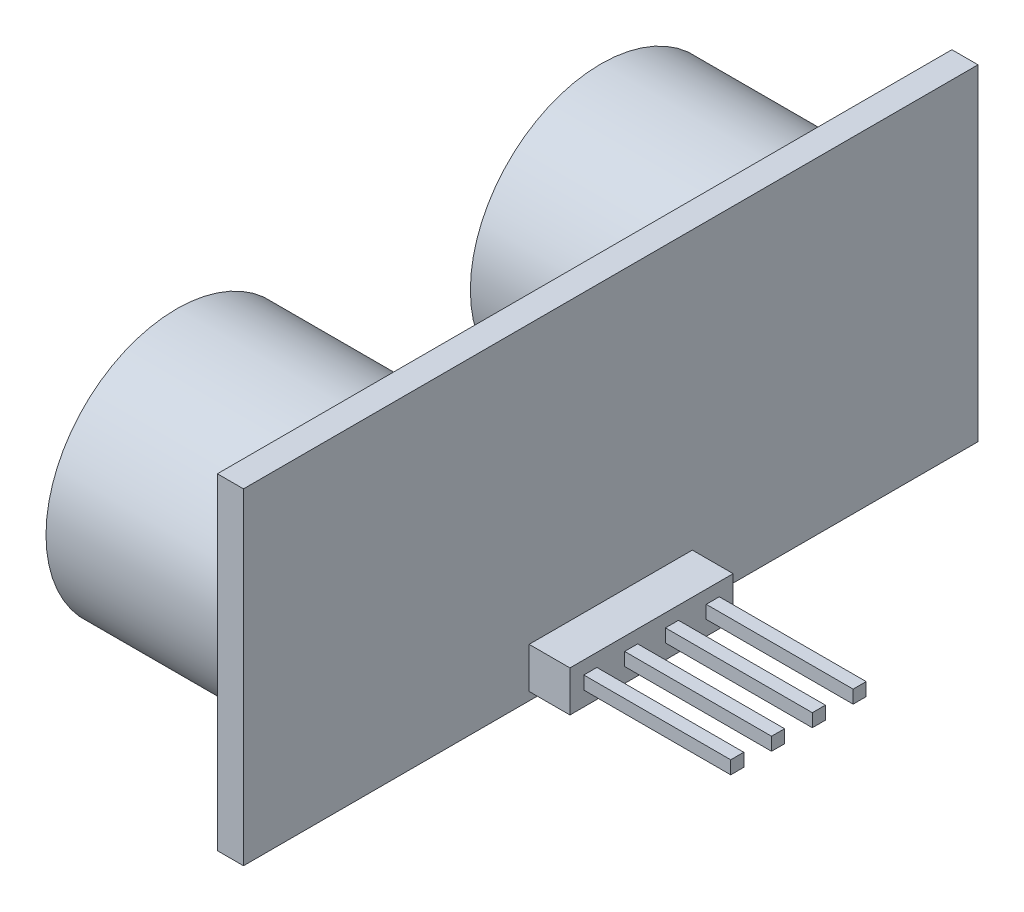
ISO-10303-21;
HEADER;
FILE_DESCRIPTION(('STEP AP214'),'2;1');
FILE_NAME('part.step','',(''),(''),'','','');
FILE_SCHEMA(('AUTOMOTIVE_DESIGN { 1 0 10303 214 1 1 1 1 }'));
ENDSEC;
DATA;
#1=APPLICATION_CONTEXT('core data for automotive mechanical design processes');
#2=APPLICATION_PROTOCOL_DEFINITION('international standard','automotive_design',2000,#1);
#3=PRODUCT_CONTEXT('',#1,'mechanical');
#4=PRODUCT('Part','Part','',(#3));
#5=PRODUCT_RELATED_PRODUCT_CATEGORY('part','',(#4));
#6=PRODUCT_DEFINITION_FORMATION('','',#4);
#7=PRODUCT_DEFINITION_CONTEXT('part definition',#1,'design');
#8=PRODUCT_DEFINITION('design','',#6,#7);
#9=PRODUCT_DEFINITION_SHAPE('','',#8);
#10=(LENGTH_UNIT() NAMED_UNIT(*) SI_UNIT(.MILLI.,.METRE.));
#11=(NAMED_UNIT(*) PLANE_ANGLE_UNIT() SI_UNIT($,.RADIAN.));
#12=(NAMED_UNIT(*) SI_UNIT($,.STERADIAN.) SOLID_ANGLE_UNIT());
#13=UNCERTAINTY_MEASURE_WITH_UNIT(LENGTH_MEASURE(1.E-05),#10,'distance_accuracy_value','');
#14=(GEOMETRIC_REPRESENTATION_CONTEXT(3) GLOBAL_UNCERTAINTY_ASSIGNED_CONTEXT((#13)) GLOBAL_UNIT_ASSIGNED_CONTEXT((#10,
#11,#12)) REPRESENTATION_CONTEXT('',''));
#15=CARTESIAN_POINT('',(0.,0.,0.));
#16=DIRECTION('',(0.,0.,1.));
#17=DIRECTION('',(1.,0.,0.));
#18=AXIS2_PLACEMENT_3D('',#15,#16,#17);
#19=CARTESIAN_POINT('',(0.8,-9.99999999999999,45.));
#20=DIRECTION('',(-1.,0.,0.));
#21=DIRECTION('',(0.,0.,1.));
#22=AXIS2_PLACEMENT_3D('',#19,#20,#21);
#23=PLANE('',#22);
#24=DIRECTION('',(0.,1.,0.));
#25=VECTOR('',#24,1.);
#26=CARTESIAN_POINT('',(0.8,-9.99999999999999,0.));
#27=LINE('',#26,#25);
#28=CARTESIAN_POINT('',(0.8,-9.99999999999999,0.));
#29=VERTEX_POINT('',#28);
#30=CARTESIAN_POINT('',(0.8,10.,0.));
#31=VERTEX_POINT('',#30);
#32=EDGE_CURVE('E363',#29,#31,#27,.T.);
#33=ORIENTED_EDGE('',*,*,#32,.T.);
#34=DIRECTION('',(0.,0.,-1.));
#35=VECTOR('',#34,1.);
#36=CARTESIAN_POINT('',(0.8,10.,45.));
#37=LINE('',#36,#35);
#38=CARTESIAN_POINT('',(0.8,10.,45.));
#39=VERTEX_POINT('',#38);
#40=EDGE_CURVE('E390',#39,#31,#37,.T.);
#41=ORIENTED_EDGE('',*,*,#40,.F.);
#42=DIRECTION('',(0.,1.,0.));
#43=VECTOR('',#42,1.);
#44=CARTESIAN_POINT('',(0.8,-9.99999999999999,45.));
#45=LINE('',#44,#43);
#46=CARTESIAN_POINT('',(0.8,-9.99999999999999,45.));
#47=VERTEX_POINT('',#46);
#48=EDGE_CURVE('E364',#47,#39,#45,.T.);
#49=ORIENTED_EDGE('',*,*,#48,.F.);
#50=DIRECTION('',(0.,0.,-1.));
#51=VECTOR('',#50,1.);
#52=CARTESIAN_POINT('',(0.8,-9.99999999999999,45.));
#53=LINE('',#52,#51);
#54=EDGE_CURVE('E374',#47,#29,#53,.T.);
#55=ORIENTED_EDGE('',*,*,#54,.T.);
#56=EDGE_LOOP('',(#33,#41,#49,#55));
#57=FACE_BOUND('',#56,.T.);
#58=DIRECTION('',(0.,1.,0.));
#59=VECTOR('',#58,1.);
#60=CARTESIAN_POINT('',(0.8,-6.99999999999999,17.5));
#61=LINE('',#60,#59);
#62=CARTESIAN_POINT('',(0.8,-9.49999999999999,17.5));
#63=VERTEX_POINT('',#62);
#64=CARTESIAN_POINT('',(0.8,-6.99999999999999,17.5));
#65=VERTEX_POINT('',#64);
#66=EDGE_CURVE('E322',#63,#65,#61,.T.);
#67=ORIENTED_EDGE('',*,*,#66,.F.);
#68=DIRECTION('',(0.,0.,-1.));
#69=VECTOR('',#68,1.);
#70=CARTESIAN_POINT('',(0.8,-9.49999999999999,27.5));
#71=LINE('',#70,#69);
#72=CARTESIAN_POINT('',(0.8,-9.49999999999999,27.5));
#73=VERTEX_POINT('',#72);
#74=EDGE_CURVE('E335',#73,#63,#71,.T.);
#75=ORIENTED_EDGE('',*,*,#74,.F.);
#76=DIRECTION('',(0.,-1.,0.));
#77=VECTOR('',#76,1.);
#78=CARTESIAN_POINT('',(0.8,-6.99999999999999,27.5));
#79=LINE('',#78,#77);
#80=CARTESIAN_POINT('',(0.8,-6.99999999999999,27.5));
#81=VERTEX_POINT('',#80);
#82=EDGE_CURVE('E347',#81,#73,#79,.T.);
#83=ORIENTED_EDGE('',*,*,#82,.F.);
#84=DIRECTION('',(0.,0.,1.));
#85=VECTOR('',#84,1.);
#86=CARTESIAN_POINT('',(0.8,-6.99999999999999,27.5));
#87=LINE('',#86,#85);
#88=EDGE_CURVE('E344',#65,#81,#87,.T.);
#89=ORIENTED_EDGE('',*,*,#88,.F.);
#90=EDGE_LOOP('',(#67,#75,#83,#89));
#91=FACE_BOUND('',#90,.T.);
#92=ADVANCED_FACE('F34',(#57,#91),#23,.F.);
#93=CARTESIAN_POINT('',(-0.8,10.,45.));
#94=DIRECTION('',(0.,-1.,0.));
#95=DIRECTION('',(0.,0.,-1.));
#96=AXIS2_PLACEMENT_3D('',#93,#94,#95);
#97=PLANE('',#96);
#98=DIRECTION('',(-1.,0.,0.));
#99=VECTOR('',#98,1.);
#100=CARTESIAN_POINT('',(-0.8,10.,0.));
#101=LINE('',#100,#99);
#102=CARTESIAN_POINT('',(-0.8,10.,0.));
#103=VERTEX_POINT('',#102);
#104=EDGE_CURVE('E377',#31,#103,#101,.T.);
#105=ORIENTED_EDGE('',*,*,#104,.T.);
#106=DIRECTION('',(0.,0.,-1.));
#107=VECTOR('',#106,1.);
#108=CARTESIAN_POINT('',(-0.8,10.,45.));
#109=LINE('',#108,#107);
#110=CARTESIAN_POINT('',(-0.8,10.,45.));
#111=VERTEX_POINT('',#110);
#112=EDGE_CURVE('E387',#111,#103,#109,.T.);
#113=ORIENTED_EDGE('',*,*,#112,.F.);
#114=DIRECTION('',(-1.,0.,0.));
#115=VECTOR('',#114,1.);
#116=CARTESIAN_POINT('',(-0.8,10.,45.));
#117=LINE('',#116,#115);
#118=EDGE_CURVE('E367',#39,#111,#117,.T.);
#119=ORIENTED_EDGE('',*,*,#118,.F.);
#120=ORIENTED_EDGE('',*,*,#40,.T.);
#121=EDGE_LOOP('',(#105,#113,#119,#120));
#122=FACE_BOUND('',#121,.T.);
#123=ADVANCED_FACE('F401',(#122),#97,.F.);
#124=CARTESIAN_POINT('',(-0.8,-9.99999999999999,45.));
#125=DIRECTION('',(1.,0.,0.));
#126=DIRECTION('',(0.,0.,-1.));
#127=AXIS2_PLACEMENT_3D('',#124,#125,#126);
#128=PLANE('',#127);
#129=CARTESIAN_POINT('',(-0.8,0.,35.5));
#130=DIRECTION('',(1.,0.,0.));
#131=DIRECTION('',(0.,0.,-1.));
#132=AXIS2_PLACEMENT_3D('',#129,#130,#131);
#133=CIRCLE('',#132,8.);
#134=CARTESIAN_POINT('',(-0.8,0.,27.5));
#135=VERTEX_POINT('',#134);
#136=EDGE_CURVE('E11',#135,#135,#133,.F.);
#137=ORIENTED_EDGE('',*,*,#136,.F.);
#138=EDGE_LOOP('',(#137));
#139=FACE_BOUND('',#138,.T.);
#140=CARTESIAN_POINT('',(-0.8,0.,9.5));
#141=DIRECTION('',(1.,0.,0.));
#142=DIRECTION('',(0.,0.,-1.));
#143=AXIS2_PLACEMENT_3D('',#140,#141,#142);
#144=CIRCLE('',#143,8.);
#145=CARTESIAN_POINT('',(-0.8,0.,1.5));
#146=VERTEX_POINT('',#145);
#147=EDGE_CURVE('E41',#146,#146,#144,.F.);
#148=ORIENTED_EDGE('',*,*,#147,.F.);
#149=EDGE_LOOP('',(#148));
#150=FACE_BOUND('',#149,.T.);
#151=DIRECTION('',(0.,-1.,0.));
#152=VECTOR('',#151,1.);
#153=CARTESIAN_POINT('',(-0.8,-9.99999999999999,0.));
#154=LINE('',#153,#152);
#155=CARTESIAN_POINT('',(-0.8,-9.99999999999999,0.));
#156=VERTEX_POINT('',#155);
#157=EDGE_CURVE('E379',#103,#156,#154,.T.);
#158=ORIENTED_EDGE('',*,*,#157,.T.);
#159=DIRECTION('',(0.,0.,-1.));
#160=VECTOR('',#159,1.);
#161=CARTESIAN_POINT('',(-0.8,-9.99999999999999,45.));
#162=LINE('',#161,#160);
#163=CARTESIAN_POINT('',(-0.8,-9.99999999999999,45.));
#164=VERTEX_POINT('',#163);
#165=EDGE_CURVE('E384',#164,#156,#162,.T.);
#166=ORIENTED_EDGE('',*,*,#165,.F.);
#167=DIRECTION('',(0.,-1.,0.));
#168=VECTOR('',#167,1.);
#169=CARTESIAN_POINT('',(-0.8,-9.99999999999999,45.));
#170=LINE('',#169,#168);
#171=EDGE_CURVE('E370',#111,#164,#170,.T.);
#172=ORIENTED_EDGE('',*,*,#171,.F.);
#173=ORIENTED_EDGE('',*,*,#112,.T.);
#174=EDGE_LOOP('',(#158,#166,#172,#173));
#175=FACE_BOUND('',#174,.T.);
#176=ADVANCED_FACE('F397',(#139,#150,#175),#128,.F.);
#177=CARTESIAN_POINT('',(-0.8,-9.99999999999999,45.));
#178=DIRECTION('',(0.,1.,0.));
#179=DIRECTION('',(0.,0.,1.));
#180=AXIS2_PLACEMENT_3D('',#177,#178,#179);
#181=PLANE('',#180);
#182=DIRECTION('',(1.,0.,0.));
#183=VECTOR('',#182,1.);
#184=CARTESIAN_POINT('',(-0.8,-9.99999999999999,0.));
#185=LINE('',#184,#183);
#186=EDGE_CURVE('E368',#156,#29,#185,.T.);
#187=ORIENTED_EDGE('',*,*,#186,.T.);
#188=ORIENTED_EDGE('',*,*,#54,.F.);
#189=DIRECTION('',(1.,0.,0.));
#190=VECTOR('',#189,1.);
#191=CARTESIAN_POINT('',(-0.8,-9.99999999999999,45.));
#192=LINE('',#191,#190);
#193=EDGE_CURVE('E372',#164,#47,#192,.T.);
#194=ORIENTED_EDGE('',*,*,#193,.F.);
#195=ORIENTED_EDGE('',*,*,#165,.T.);
#196=EDGE_LOOP('',(#187,#188,#194,#195));
#197=FACE_BOUND('',#196,.T.);
#198=ADVANCED_FACE('F400',(#197),#181,.F.);
#199=CARTESIAN_POINT('',(0.,0.,45.));
#200=DIRECTION('',(0.,0.,-1.));
#201=DIRECTION('',(-1.,0.,0.));
#202=AXIS2_PLACEMENT_3D('',#199,#200,#201);
#203=PLANE('',#202);
#204=ORIENTED_EDGE('',*,*,#48,.T.);
#205=ORIENTED_EDGE('',*,*,#118,.T.);
#206=ORIENTED_EDGE('',*,*,#171,.T.);
#207=ORIENTED_EDGE('',*,*,#193,.T.);
#208=EDGE_LOOP('',(#204,#205,#206,#207));
#209=FACE_BOUND('',#208,.T.);
#210=ADVANCED_FACE('F420',(#209),#203,.F.);
#211=CARTESIAN_POINT('',(0.,0.,0.));
#212=DIRECTION('',(0.,0.,-1.));
#213=DIRECTION('',(-1.,0.,0.));
#214=AXIS2_PLACEMENT_3D('',#211,#212,#213);
#215=PLANE('',#214);
#216=ORIENTED_EDGE('',*,*,#32,.F.);
#217=ORIENTED_EDGE('',*,*,#186,.F.);
#218=ORIENTED_EDGE('',*,*,#157,.F.);
#219=ORIENTED_EDGE('',*,*,#104,.F.);
#220=EDGE_LOOP('',(#216,#217,#218,#219));
#221=FACE_BOUND('',#220,.T.);
#222=ADVANCED_FACE('F414',(#221),#215,.T.);
#223=CARTESIAN_POINT('',(3.3,-6.99999999999999,17.5));
#224=DIRECTION('',(0.,0.,1.));
#225=DIRECTION('',(1.,0.,0.));
#226=AXIS2_PLACEMENT_3D('',#223,#224,#225);
#227=PLANE('',#226);
#228=ORIENTED_EDGE('',*,*,#66,.T.);
#229=DIRECTION('',(-1.,0.,0.));
#230=VECTOR('',#229,1.);
#231=CARTESIAN_POINT('',(3.3,-6.99999999999999,17.5));
#232=LINE('',#231,#230);
#233=CARTESIAN_POINT('',(3.3,-6.99999999999999,17.5));
#234=VERTEX_POINT('',#233);
#235=EDGE_CURVE('E360',#234,#65,#232,.T.);
#236=ORIENTED_EDGE('',*,*,#235,.F.);
#237=DIRECTION('',(0.,1.,0.));
#238=VECTOR('',#237,1.);
#239=CARTESIAN_POINT('',(3.3,-6.99999999999999,17.5));
#240=LINE('',#239,#238);
#241=CARTESIAN_POINT('',(3.3,-9.49999999999999,17.5));
#242=VERTEX_POINT('',#241);
#243=EDGE_CURVE('E331',#242,#234,#240,.T.);
#244=ORIENTED_EDGE('',*,*,#243,.F.);
#245=DIRECTION('',(-1.,0.,0.));
#246=VECTOR('',#245,1.);
#247=CARTESIAN_POINT('',(3.3,-9.49999999999999,17.5));
#248=LINE('',#247,#246);
#249=EDGE_CURVE('E341',#242,#63,#248,.T.);
#250=ORIENTED_EDGE('',*,*,#249,.T.);
#251=EDGE_LOOP('',(#228,#236,#244,#250));
#252=FACE_BOUND('',#251,.T.);
#253=ADVANCED_FACE('F431',(#252),#227,.F.);
#254=CARTESIAN_POINT('',(3.3,-6.99999999999999,27.5));
#255=DIRECTION('',(0.,-1.,0.));
#256=DIRECTION('',(0.,0.,-1.));
#257=AXIS2_PLACEMENT_3D('',#254,#255,#256);
#258=PLANE('',#257);
#259=ORIENTED_EDGE('',*,*,#88,.T.);
#260=DIRECTION('',(-1.,0.,0.));
#261=VECTOR('',#260,1.);
#262=CARTESIAN_POINT('',(3.3,-6.99999999999999,27.5));
#263=LINE('',#262,#261);
#264=CARTESIAN_POINT('',(3.3,-6.99999999999999,27.5));
#265=VERTEX_POINT('',#264);
#266=EDGE_CURVE('E357',#265,#81,#263,.T.);
#267=ORIENTED_EDGE('',*,*,#266,.F.);
#268=DIRECTION('',(0.,0.,1.));
#269=VECTOR('',#268,1.);
#270=CARTESIAN_POINT('',(3.3,-6.99999999999999,27.5));
#271=LINE('',#270,#269);
#272=EDGE_CURVE('E334',#234,#265,#271,.T.);
#273=ORIENTED_EDGE('',*,*,#272,.F.);
#274=ORIENTED_EDGE('',*,*,#235,.T.);
#275=EDGE_LOOP('',(#259,#267,#273,#274));
#276=FACE_BOUND('',#275,.T.);
#277=ADVANCED_FACE('F436',(#276),#258,.F.);
#278=CARTESIAN_POINT('',(3.3,-6.99999999999999,27.5));
#279=DIRECTION('',(0.,0.,-1.));
#280=DIRECTION('',(-1.,0.,0.));
#281=AXIS2_PLACEMENT_3D('',#278,#279,#280);
#282=PLANE('',#281);
#283=ORIENTED_EDGE('',*,*,#82,.T.);
#284=DIRECTION('',(-1.,0.,0.));
#285=VECTOR('',#284,1.);
#286=CARTESIAN_POINT('',(3.3,-9.49999999999999,27.5));
#287=LINE('',#286,#285);
#288=CARTESIAN_POINT('',(3.3,-9.49999999999999,27.5));
#289=VERTEX_POINT('',#288);
#290=EDGE_CURVE('E354',#289,#73,#287,.T.);
#291=ORIENTED_EDGE('',*,*,#290,.F.);
#292=DIRECTION('',(0.,-1.,0.));
#293=VECTOR('',#292,1.);
#294=CARTESIAN_POINT('',(3.3,-6.99999999999999,27.5));
#295=LINE('',#294,#293);
#296=EDGE_CURVE('E337',#265,#289,#295,.T.);
#297=ORIENTED_EDGE('',*,*,#296,.F.);
#298=ORIENTED_EDGE('',*,*,#266,.T.);
#299=EDGE_LOOP('',(#283,#291,#297,#298));
#300=FACE_BOUND('',#299,.T.);
#301=ADVANCED_FACE('F440',(#300),#282,.F.);
#302=CARTESIAN_POINT('',(3.3,-9.49999999999999,27.5));
#303=DIRECTION('',(0.,1.,0.));
#304=DIRECTION('',(0.,0.,1.));
#305=AXIS2_PLACEMENT_3D('',#302,#303,#304);
#306=PLANE('',#305);
#307=ORIENTED_EDGE('',*,*,#74,.T.);
#308=ORIENTED_EDGE('',*,*,#249,.F.);
#309=DIRECTION('',(0.,0.,-1.));
#310=VECTOR('',#309,1.);
#311=CARTESIAN_POINT('',(3.3,-9.49999999999999,27.5));
#312=LINE('',#311,#310);
#313=EDGE_CURVE('E339',#289,#242,#312,.T.);
#314=ORIENTED_EDGE('',*,*,#313,.F.);
#315=ORIENTED_EDGE('',*,*,#290,.T.);
#316=EDGE_LOOP('',(#307,#308,#314,#315));
#317=FACE_BOUND('',#316,.T.);
#318=ADVANCED_FACE('F444',(#317),#306,.F.);
#319=CARTESIAN_POINT('',(3.3,0.,0.));
#320=DIRECTION('',(1.,0.,0.));
#321=DIRECTION('',(0.,0.,-1.));
#322=AXIS2_PLACEMENT_3D('',#319,#320,#321);
#323=PLANE('',#322);
#324=DIRECTION('',(0.,0.,1.));
#325=VECTOR('',#324,1.);
#326=CARTESIAN_POINT('',(3.3,-8.60094628195553,19.15));
#327=LINE('',#326,#325);
#328=CARTESIAN_POINT('',(3.3,-8.60094628195553,18.35));
#329=VERTEX_POINT('',#328);
#330=CARTESIAN_POINT('',(3.3,-8.60094628195553,19.15));
#331=VERTEX_POINT('',#330);
#332=EDGE_CURVE('E226',#329,#331,#327,.T.);
#333=ORIENTED_EDGE('',*,*,#332,.T.);
#334=DIRECTION('',(0.,1.,0.));
#335=VECTOR('',#334,1.);
#336=CARTESIAN_POINT('',(3.3,-7.80094628195553,19.15));
#337=LINE('',#336,#335);
#338=CARTESIAN_POINT('',(3.3,-7.80094628195553,19.15));
#339=VERTEX_POINT('',#338);
#340=EDGE_CURVE('E199',#331,#339,#337,.T.);
#341=ORIENTED_EDGE('',*,*,#340,.T.);
#342=DIRECTION('',(0.,0.,-1.));
#343=VECTOR('',#342,1.);
#344=CARTESIAN_POINT('',(3.3,-7.80094628195553,19.15));
#345=LINE('',#344,#343);
#346=CARTESIAN_POINT('',(3.3,-7.80094628195553,18.35));
#347=VERTEX_POINT('',#346);
#348=EDGE_CURVE('E53',#339,#347,#345,.T.);
#349=ORIENTED_EDGE('',*,*,#348,.T.);
#350=DIRECTION('',(0.,-1.,0.));
#351=VECTOR('',#350,1.);
#352=CARTESIAN_POINT('',(3.3,-7.80094628195553,18.35));
#353=LINE('',#352,#351);
#354=EDGE_CURVE('E48',#347,#329,#353,.T.);
#355=ORIENTED_EDGE('',*,*,#354,.T.);
#356=EDGE_LOOP('',(#333,#341,#349,#355));
#357=FACE_BOUND('',#356,.T.);
#358=DIRECTION('',(0.,0.,1.));
#359=VECTOR('',#358,1.);
#360=CARTESIAN_POINT('',(3.3,-8.6009462819555,21.65));
#361=LINE('',#360,#359);
#362=CARTESIAN_POINT('',(3.3,-8.6009462819555,20.85));
#363=VERTEX_POINT('',#362);
#364=CARTESIAN_POINT('',(3.3,-8.6009462819555,21.65));
#365=VERTEX_POINT('',#364);
#366=EDGE_CURVE('E231',#363,#365,#361,.T.);
#367=ORIENTED_EDGE('',*,*,#366,.T.);
#368=DIRECTION('',(0.,1.,0.));
#369=VECTOR('',#368,1.);
#370=CARTESIAN_POINT('',(3.3,-7.8009462819555,21.65));
#371=LINE('',#370,#369);
#372=CARTESIAN_POINT('',(3.3,-7.8009462819555,21.65));
#373=VERTEX_POINT('',#372);
#374=EDGE_CURVE('E250',#365,#373,#371,.T.);
#375=ORIENTED_EDGE('',*,*,#374,.T.);
#376=DIRECTION('',(0.,0.,-1.));
#377=VECTOR('',#376,1.);
#378=CARTESIAN_POINT('',(3.3,-7.8009462819555,21.65));
#379=LINE('',#378,#377);
#380=CARTESIAN_POINT('',(3.3,-7.8009462819555,20.85));
#381=VERTEX_POINT('',#380);
#382=EDGE_CURVE('E252',#373,#381,#379,.T.);
#383=ORIENTED_EDGE('',*,*,#382,.T.);
#384=DIRECTION('',(0.,-1.,0.));
#385=VECTOR('',#384,1.);
#386=CARTESIAN_POINT('',(3.3,-7.8009462819555,20.85));
#387=LINE('',#386,#385);
#388=EDGE_CURVE('E239',#381,#363,#387,.T.);
#389=ORIENTED_EDGE('',*,*,#388,.T.);
#390=EDGE_LOOP('',(#367,#375,#383,#389));
#391=FACE_BOUND('',#390,.T.);
#392=DIRECTION('',(0.,0.,1.));
#393=VECTOR('',#392,1.);
#394=CARTESIAN_POINT('',(3.3,-8.60094628195548,24.15));
#395=LINE('',#394,#393);
#396=CARTESIAN_POINT('',(3.3,-8.60094628195548,23.35));
#397=VERTEX_POINT('',#396);
#398=CARTESIAN_POINT('',(3.3,-8.60094628195548,24.15));
#399=VERTEX_POINT('',#398);
#400=EDGE_CURVE('E258',#397,#399,#395,.T.);
#401=ORIENTED_EDGE('',*,*,#400,.T.);
#402=DIRECTION('',(0.,1.,0.));
#403=VECTOR('',#402,1.);
#404=CARTESIAN_POINT('',(3.3,-7.80094628195548,24.15));
#405=LINE('',#404,#403);
#406=CARTESIAN_POINT('',(3.3,-7.80094628195548,24.15));
#407=VERTEX_POINT('',#406);
#408=EDGE_CURVE('E282',#399,#407,#405,.T.);
#409=ORIENTED_EDGE('',*,*,#408,.T.);
#410=DIRECTION('',(0.,0.,-1.));
#411=VECTOR('',#410,1.);
#412=CARTESIAN_POINT('',(3.3,-7.80094628195548,24.15));
#413=LINE('',#412,#411);
#414=CARTESIAN_POINT('',(3.3,-7.80094628195548,23.35));
#415=VERTEX_POINT('',#414);
#416=EDGE_CURVE('E284',#407,#415,#413,.T.);
#417=ORIENTED_EDGE('',*,*,#416,.T.);
#418=DIRECTION('',(0.,-1.,0.));
#419=VECTOR('',#418,1.);
#420=CARTESIAN_POINT('',(3.3,-7.80094628195548,23.35));
#421=LINE('',#420,#419);
#422=EDGE_CURVE('E271',#415,#397,#421,.T.);
#423=ORIENTED_EDGE('',*,*,#422,.T.);
#424=EDGE_LOOP('',(#401,#409,#417,#423));
#425=FACE_BOUND('',#424,.T.);
#426=DIRECTION('',(0.,0.,1.));
#427=VECTOR('',#426,1.);
#428=CARTESIAN_POINT('',(3.3,-8.60094628195545,26.65));
#429=LINE('',#428,#427);
#430=CARTESIAN_POINT('',(3.3,-8.60094628195545,25.85));
#431=VERTEX_POINT('',#430);
#432=CARTESIAN_POINT('',(3.3,-8.60094628195545,26.65));
#433=VERTEX_POINT('',#432);
#434=EDGE_CURVE('E290',#431,#433,#429,.T.);
#435=ORIENTED_EDGE('',*,*,#434,.T.);
#436=DIRECTION('',(0.,1.,0.));
#437=VECTOR('',#436,1.);
#438=CARTESIAN_POINT('',(3.3,-7.80094628195545,26.65));
#439=LINE('',#438,#437);
#440=CARTESIAN_POINT('',(3.3,-7.80094628195545,26.65));
#441=VERTEX_POINT('',#440);
#442=EDGE_CURVE('E314',#433,#441,#439,.T.);
#443=ORIENTED_EDGE('',*,*,#442,.T.);
#444=DIRECTION('',(0.,0.,-1.));
#445=VECTOR('',#444,1.);
#446=CARTESIAN_POINT('',(3.3,-7.80094628195545,26.65));
#447=LINE('',#446,#445);
#448=CARTESIAN_POINT('',(3.3,-7.80094628195545,25.85));
#449=VERTEX_POINT('',#448);
#450=EDGE_CURVE('E316',#441,#449,#447,.T.);
#451=ORIENTED_EDGE('',*,*,#450,.T.);
#452=DIRECTION('',(0.,-1.,0.));
#453=VECTOR('',#452,1.);
#454=CARTESIAN_POINT('',(3.3,-7.80094628195545,25.85));
#455=LINE('',#454,#453);
#456=EDGE_CURVE('E303',#449,#431,#455,.T.);
#457=ORIENTED_EDGE('',*,*,#456,.T.);
#458=EDGE_LOOP('',(#435,#443,#451,#457));
#459=FACE_BOUND('',#458,.T.);
#460=ORIENTED_EDGE('',*,*,#243,.T.);
#461=ORIENTED_EDGE('',*,*,#272,.T.);
#462=ORIENTED_EDGE('',*,*,#296,.T.);
#463=ORIENTED_EDGE('',*,*,#313,.T.);
#464=EDGE_LOOP('',(#460,#461,#462,#463));
#465=FACE_BOUND('',#464,.T.);
#466=ADVANCED_FACE('F448',(#357,#391,#425,#459,#465),#323,.T.);
#467=CARTESIAN_POINT('',(12.3,-8.60094628195545,26.65));
#468=DIRECTION('',(0.,-1.,0.));
#469=DIRECTION('',(0.,0.,-1.));
#470=AXIS2_PLACEMENT_3D('',#467,#468,#469);
#471=PLANE('',#470);
#472=ORIENTED_EDGE('',*,*,#434,.F.);
#473=DIRECTION('',(-1.,0.,0.));
#474=VECTOR('',#473,1.);
#475=CARTESIAN_POINT('',(12.3,-8.60094628195545,25.85));
#476=LINE('',#475,#474);
#477=CARTESIAN_POINT('',(12.3,-8.60094628195545,25.85));
#478=VERTEX_POINT('',#477);
#479=EDGE_CURVE('E319',#478,#431,#476,.T.);
#480=ORIENTED_EDGE('',*,*,#479,.F.);
#481=DIRECTION('',(0.,0.,1.));
#482=VECTOR('',#481,1.);
#483=CARTESIAN_POINT('',(12.3,-8.60094628195545,26.65));
#484=LINE('',#483,#482);
#485=CARTESIAN_POINT('',(12.3,-8.60094628195545,26.65));
#486=VERTEX_POINT('',#485);
#487=EDGE_CURVE('E299',#478,#486,#484,.T.);
#488=ORIENTED_EDGE('',*,*,#487,.T.);
#489=DIRECTION('',(-1.,0.,0.));
#490=VECTOR('',#489,1.);
#491=CARTESIAN_POINT('',(12.3,-8.60094628195545,26.65));
#492=LINE('',#491,#490);
#493=EDGE_CURVE('E312',#486,#433,#492,.T.);
#494=ORIENTED_EDGE('',*,*,#493,.T.);
#495=EDGE_LOOP('',(#472,#480,#488,#494));
#496=FACE_BOUND('',#495,.T.);
#497=ADVANCED_FACE('F452',(#496),#471,.T.);
#498=CARTESIAN_POINT('',(12.3,-7.80094628195545,25.85));
#499=DIRECTION('',(0.,0.,-1.));
#500=DIRECTION('',(-1.,0.,0.));
#501=AXIS2_PLACEMENT_3D('',#498,#499,#500);
#502=PLANE('',#501);
#503=ORIENTED_EDGE('',*,*,#456,.F.);
#504=DIRECTION('',(-1.,0.,0.));
#505=VECTOR('',#504,1.);
#506=CARTESIAN_POINT('',(12.3,-7.80094628195545,25.85));
#507=LINE('',#506,#505);
#508=CARTESIAN_POINT('',(12.3,-7.80094628195545,25.85));
#509=VERTEX_POINT('',#508);
#510=EDGE_CURVE('E323',#509,#449,#507,.T.);
#511=ORIENTED_EDGE('',*,*,#510,.F.);
#512=DIRECTION('',(0.,-1.,0.));
#513=VECTOR('',#512,1.);
#514=CARTESIAN_POINT('',(12.3,-7.80094628195545,25.85));
#515=LINE('',#514,#513);
#516=EDGE_CURVE('E309',#509,#478,#515,.T.);
#517=ORIENTED_EDGE('',*,*,#516,.T.);
#518=ORIENTED_EDGE('',*,*,#479,.T.);
#519=EDGE_LOOP('',(#503,#511,#517,#518));
#520=FACE_BOUND('',#519,.T.);
#521=ADVANCED_FACE('F455',(#520),#502,.T.);
#522=CARTESIAN_POINT('',(12.3,-7.80094628195545,26.65));
#523=DIRECTION('',(0.,1.,0.));
#524=DIRECTION('',(0.,0.,1.));
#525=AXIS2_PLACEMENT_3D('',#522,#523,#524);
#526=PLANE('',#525);
#527=ORIENTED_EDGE('',*,*,#450,.F.);
#528=DIRECTION('',(-1.,0.,0.));
#529=VECTOR('',#528,1.);
#530=CARTESIAN_POINT('',(12.3,-7.80094628195545,26.65));
#531=LINE('',#530,#529);
#532=CARTESIAN_POINT('',(12.3,-7.80094628195545,26.65));
#533=VERTEX_POINT('',#532);
#534=EDGE_CURVE('E326',#533,#441,#531,.T.);
#535=ORIENTED_EDGE('',*,*,#534,.F.);
#536=DIRECTION('',(0.,0.,-1.));
#537=VECTOR('',#536,1.);
#538=CARTESIAN_POINT('',(12.3,-7.80094628195545,26.65));
#539=LINE('',#538,#537);
#540=EDGE_CURVE('E306',#533,#509,#539,.T.);
#541=ORIENTED_EDGE('',*,*,#540,.T.);
#542=ORIENTED_EDGE('',*,*,#510,.T.);
#543=EDGE_LOOP('',(#527,#535,#541,#542));
#544=FACE_BOUND('',#543,.T.);
#545=ADVANCED_FACE('F461',(#544),#526,.T.);
#546=CARTESIAN_POINT('',(12.3,-7.80094628195545,26.65));
#547=DIRECTION('',(0.,0.,1.));
#548=DIRECTION('',(1.,0.,0.));
#549=AXIS2_PLACEMENT_3D('',#546,#547,#548);
#550=PLANE('',#549);
#551=ORIENTED_EDGE('',*,*,#442,.F.);
#552=ORIENTED_EDGE('',*,*,#493,.F.);
#553=DIRECTION('',(0.,1.,0.));
#554=VECTOR('',#553,1.);
#555=CARTESIAN_POINT('',(12.3,-7.80094628195545,26.65));
#556=LINE('',#555,#554);
#557=EDGE_CURVE('E302',#486,#533,#556,.T.);
#558=ORIENTED_EDGE('',*,*,#557,.T.);
#559=ORIENTED_EDGE('',*,*,#534,.T.);
#560=EDGE_LOOP('',(#551,#552,#558,#559));
#561=FACE_BOUND('',#560,.T.);
#562=ADVANCED_FACE('F457',(#561),#550,.T.);
#563=CARTESIAN_POINT('',(12.3,0.,0.));
#564=DIRECTION('',(-1.,0.,0.));
#565=DIRECTION('',(0.,0.,1.));
#566=AXIS2_PLACEMENT_3D('',#563,#564,#565);
#567=PLANE('',#566);
#568=ORIENTED_EDGE('',*,*,#487,.F.);
#569=ORIENTED_EDGE('',*,*,#516,.F.);
#570=ORIENTED_EDGE('',*,*,#540,.F.);
#571=ORIENTED_EDGE('',*,*,#557,.F.);
#572=EDGE_LOOP('',(#568,#569,#570,#571));
#573=FACE_BOUND('',#572,.T.);
#574=ADVANCED_FACE('F460',(#573),#567,.F.);
#575=CARTESIAN_POINT('',(12.3,-8.60094628195548,24.15));
#576=DIRECTION('',(0.,-1.,0.));
#577=DIRECTION('',(0.,0.,-1.));
#578=AXIS2_PLACEMENT_3D('',#575,#576,#577);
#579=PLANE('',#578);
#580=ORIENTED_EDGE('',*,*,#400,.F.);
#581=DIRECTION('',(-1.,0.,0.));
#582=VECTOR('',#581,1.);
#583=CARTESIAN_POINT('',(12.3,-8.60094628195548,23.35));
#584=LINE('',#583,#582);
#585=CARTESIAN_POINT('',(12.3,-8.60094628195548,23.35));
#586=VERTEX_POINT('',#585);
#587=EDGE_CURVE('E287',#586,#397,#584,.T.);
#588=ORIENTED_EDGE('',*,*,#587,.F.);
#589=DIRECTION('',(0.,0.,1.));
#590=VECTOR('',#589,1.);
#591=CARTESIAN_POINT('',(12.3,-8.60094628195548,24.15));
#592=LINE('',#591,#590);
#593=CARTESIAN_POINT('',(12.3,-8.60094628195548,24.15));
#594=VERTEX_POINT('',#593);
#595=EDGE_CURVE('E267',#586,#594,#592,.T.);
#596=ORIENTED_EDGE('',*,*,#595,.T.);
#597=DIRECTION('',(-1.,0.,0.));
#598=VECTOR('',#597,1.);
#599=CARTESIAN_POINT('',(12.3,-8.60094628195548,24.15));
#600=LINE('',#599,#598);
#601=EDGE_CURVE('E280',#594,#399,#600,.T.);
#602=ORIENTED_EDGE('',*,*,#601,.T.);
#603=EDGE_LOOP('',(#580,#588,#596,#602));
#604=FACE_BOUND('',#603,.T.);
#605=ADVANCED_FACE('F471',(#604),#579,.T.);
#606=CARTESIAN_POINT('',(12.3,-7.80094628195548,23.35));
#607=DIRECTION('',(0.,0.,-1.));
#608=DIRECTION('',(-1.,0.,0.));
#609=AXIS2_PLACEMENT_3D('',#606,#607,#608);
#610=PLANE('',#609);
#611=ORIENTED_EDGE('',*,*,#422,.F.);
#612=DIRECTION('',(-1.,0.,0.));
#613=VECTOR('',#612,1.);
#614=CARTESIAN_POINT('',(12.3,-7.80094628195548,23.35));
#615=LINE('',#614,#613);
#616=CARTESIAN_POINT('',(12.3,-7.80094628195548,23.35));
#617=VERTEX_POINT('',#616);
#618=EDGE_CURVE('E291',#617,#415,#615,.T.);
#619=ORIENTED_EDGE('',*,*,#618,.F.);
#620=DIRECTION('',(0.,-1.,0.));
#621=VECTOR('',#620,1.);
#622=CARTESIAN_POINT('',(12.3,-7.80094628195548,23.35));
#623=LINE('',#622,#621);
#624=EDGE_CURVE('E277',#617,#586,#623,.T.);
#625=ORIENTED_EDGE('',*,*,#624,.T.);
#626=ORIENTED_EDGE('',*,*,#587,.T.);
#627=EDGE_LOOP('',(#611,#619,#625,#626));
#628=FACE_BOUND('',#627,.T.);
#629=ADVANCED_FACE('F475',(#628),#610,.T.);
#630=CARTESIAN_POINT('',(12.3,-7.80094628195548,24.15));
#631=DIRECTION('',(0.,1.,0.));
#632=DIRECTION('',(0.,0.,1.));
#633=AXIS2_PLACEMENT_3D('',#630,#631,#632);
#634=PLANE('',#633);
#635=ORIENTED_EDGE('',*,*,#416,.F.);
#636=DIRECTION('',(-1.,0.,0.));
#637=VECTOR('',#636,1.);
#638=CARTESIAN_POINT('',(12.3,-7.80094628195548,24.15));
#639=LINE('',#638,#637);
#640=CARTESIAN_POINT('',(12.3,-7.80094628195548,24.15));
#641=VERTEX_POINT('',#640);
#642=EDGE_CURVE('E294',#641,#407,#639,.T.);
#643=ORIENTED_EDGE('',*,*,#642,.F.);
#644=DIRECTION('',(0.,0.,-1.));
#645=VECTOR('',#644,1.);
#646=CARTESIAN_POINT('',(12.3,-7.80094628195548,24.15));
#647=LINE('',#646,#645);
#648=EDGE_CURVE('E274',#641,#617,#647,.T.);
#649=ORIENTED_EDGE('',*,*,#648,.T.);
#650=ORIENTED_EDGE('',*,*,#618,.T.);
#651=EDGE_LOOP('',(#635,#643,#649,#650));
#652=FACE_BOUND('',#651,.T.);
#653=ADVANCED_FACE('F481',(#652),#634,.T.);
#654=CARTESIAN_POINT('',(12.3,-7.80094628195548,24.15));
#655=DIRECTION('',(0.,0.,1.));
#656=DIRECTION('',(1.,0.,0.));
#657=AXIS2_PLACEMENT_3D('',#654,#655,#656);
#658=PLANE('',#657);
#659=ORIENTED_EDGE('',*,*,#408,.F.);
#660=ORIENTED_EDGE('',*,*,#601,.F.);
#661=DIRECTION('',(0.,1.,0.));
#662=VECTOR('',#661,1.);
#663=CARTESIAN_POINT('',(12.3,-7.80094628195548,24.15));
#664=LINE('',#663,#662);
#665=EDGE_CURVE('E270',#594,#641,#664,.T.);
#666=ORIENTED_EDGE('',*,*,#665,.T.);
#667=ORIENTED_EDGE('',*,*,#642,.T.);
#668=EDGE_LOOP('',(#659,#660,#666,#667));
#669=FACE_BOUND('',#668,.T.);
#670=ADVANCED_FACE('F477',(#669),#658,.T.);
#671=CARTESIAN_POINT('',(12.3,0.,0.));
#672=DIRECTION('',(-1.,0.,0.));
#673=DIRECTION('',(0.,0.,1.));
#674=AXIS2_PLACEMENT_3D('',#671,#672,#673);
#675=PLANE('',#674);
#676=ORIENTED_EDGE('',*,*,#595,.F.);
#677=ORIENTED_EDGE('',*,*,#624,.F.);
#678=ORIENTED_EDGE('',*,*,#648,.F.);
#679=ORIENTED_EDGE('',*,*,#665,.F.);
#680=EDGE_LOOP('',(#676,#677,#678,#679));
#681=FACE_BOUND('',#680,.T.);
#682=ADVANCED_FACE('F480',(#681),#675,.F.);
#683=CARTESIAN_POINT('',(12.3,-8.6009462819555,21.65));
#684=DIRECTION('',(0.,-1.,0.));
#685=DIRECTION('',(0.,0.,-1.));
#686=AXIS2_PLACEMENT_3D('',#683,#684,#685);
#687=PLANE('',#686);
#688=ORIENTED_EDGE('',*,*,#366,.F.);
#689=DIRECTION('',(-1.,0.,0.));
#690=VECTOR('',#689,1.);
#691=CARTESIAN_POINT('',(12.3,-8.6009462819555,20.85));
#692=LINE('',#691,#690);
#693=CARTESIAN_POINT('',(12.3,-8.6009462819555,20.85));
#694=VERTEX_POINT('',#693);
#695=EDGE_CURVE('E255',#694,#363,#692,.T.);
#696=ORIENTED_EDGE('',*,*,#695,.F.);
#697=DIRECTION('',(0.,0.,1.));
#698=VECTOR('',#697,1.);
#699=CARTESIAN_POINT('',(12.3,-8.6009462819555,21.65));
#700=LINE('',#699,#698);
#701=CARTESIAN_POINT('',(12.3,-8.6009462819555,21.65));
#702=VERTEX_POINT('',#701);
#703=EDGE_CURVE('E235',#694,#702,#700,.T.);
#704=ORIENTED_EDGE('',*,*,#703,.T.);
#705=DIRECTION('',(-1.,0.,0.));
#706=VECTOR('',#705,1.);
#707=CARTESIAN_POINT('',(12.3,-8.6009462819555,21.65));
#708=LINE('',#707,#706);
#709=EDGE_CURVE('E248',#702,#365,#708,.T.);
#710=ORIENTED_EDGE('',*,*,#709,.T.);
#711=EDGE_LOOP('',(#688,#696,#704,#710));
#712=FACE_BOUND('',#711,.T.);
#713=ADVANCED_FACE('F491',(#712),#687,.T.);
#714=CARTESIAN_POINT('',(12.3,-7.8009462819555,20.85));
#715=DIRECTION('',(0.,0.,-1.));
#716=DIRECTION('',(-1.,0.,0.));
#717=AXIS2_PLACEMENT_3D('',#714,#715,#716);
#718=PLANE('',#717);
#719=ORIENTED_EDGE('',*,*,#388,.F.);
#720=DIRECTION('',(-1.,0.,0.));
#721=VECTOR('',#720,1.);
#722=CARTESIAN_POINT('',(12.3,-7.8009462819555,20.85));
#723=LINE('',#722,#721);
#724=CARTESIAN_POINT('',(12.3,-7.8009462819555,20.85));
#725=VERTEX_POINT('',#724);
#726=EDGE_CURVE('E259',#725,#381,#723,.T.);
#727=ORIENTED_EDGE('',*,*,#726,.F.);
#728=DIRECTION('',(0.,-1.,0.));
#729=VECTOR('',#728,1.);
#730=CARTESIAN_POINT('',(12.3,-7.8009462819555,20.85));
#731=LINE('',#730,#729);
#732=EDGE_CURVE('E245',#725,#694,#731,.T.);
#733=ORIENTED_EDGE('',*,*,#732,.T.);
#734=ORIENTED_EDGE('',*,*,#695,.T.);
#735=EDGE_LOOP('',(#719,#727,#733,#734));
#736=FACE_BOUND('',#735,.T.);
#737=ADVANCED_FACE('F495',(#736),#718,.T.);
#738=CARTESIAN_POINT('',(12.3,-7.8009462819555,21.65));
#739=DIRECTION('',(0.,1.,0.));
#740=DIRECTION('',(0.,0.,1.));
#741=AXIS2_PLACEMENT_3D('',#738,#739,#740);
#742=PLANE('',#741);
#743=ORIENTED_EDGE('',*,*,#382,.F.);
#744=DIRECTION('',(-1.,0.,0.));
#745=VECTOR('',#744,1.);
#746=CARTESIAN_POINT('',(12.3,-7.8009462819555,21.65));
#747=LINE('',#746,#745);
#748=CARTESIAN_POINT('',(12.3,-7.8009462819555,21.65));
#749=VERTEX_POINT('',#748);
#750=EDGE_CURVE('E262',#749,#373,#747,.T.);
#751=ORIENTED_EDGE('',*,*,#750,.F.);
#752=DIRECTION('',(0.,0.,-1.));
#753=VECTOR('',#752,1.);
#754=CARTESIAN_POINT('',(12.3,-7.8009462819555,21.65));
#755=LINE('',#754,#753);
#756=EDGE_CURVE('E242',#749,#725,#755,.T.);
#757=ORIENTED_EDGE('',*,*,#756,.T.);
#758=ORIENTED_EDGE('',*,*,#726,.T.);
#759=EDGE_LOOP('',(#743,#751,#757,#758));
#760=FACE_BOUND('',#759,.T.);
#761=ADVANCED_FACE('F501',(#760),#742,.T.);
#762=CARTESIAN_POINT('',(12.3,-7.8009462819555,21.65));
#763=DIRECTION('',(0.,0.,1.));
#764=DIRECTION('',(1.,0.,0.));
#765=AXIS2_PLACEMENT_3D('',#762,#763,#764);
#766=PLANE('',#765);
#767=ORIENTED_EDGE('',*,*,#374,.F.);
#768=ORIENTED_EDGE('',*,*,#709,.F.);
#769=DIRECTION('',(0.,1.,0.));
#770=VECTOR('',#769,1.);
#771=CARTESIAN_POINT('',(12.3,-7.8009462819555,21.65));
#772=LINE('',#771,#770);
#773=EDGE_CURVE('E238',#702,#749,#772,.T.);
#774=ORIENTED_EDGE('',*,*,#773,.T.);
#775=ORIENTED_EDGE('',*,*,#750,.T.);
#776=EDGE_LOOP('',(#767,#768,#774,#775));
#777=FACE_BOUND('',#776,.T.);
#778=ADVANCED_FACE('F497',(#777),#766,.T.);
#779=CARTESIAN_POINT('',(12.3,0.,0.));
#780=DIRECTION('',(-1.,0.,0.));
#781=DIRECTION('',(0.,0.,1.));
#782=AXIS2_PLACEMENT_3D('',#779,#780,#781);
#783=PLANE('',#782);
#784=ORIENTED_EDGE('',*,*,#703,.F.);
#785=ORIENTED_EDGE('',*,*,#732,.F.);
#786=ORIENTED_EDGE('',*,*,#756,.F.);
#787=ORIENTED_EDGE('',*,*,#773,.F.);
#788=EDGE_LOOP('',(#784,#785,#786,#787));
#789=FACE_BOUND('',#788,.T.);
#790=ADVANCED_FACE('F500',(#789),#783,.F.);
#791=CARTESIAN_POINT('',(12.3,-8.60094628195553,19.15));
#792=DIRECTION('',(0.,-1.,0.));
#793=DIRECTION('',(0.,0.,-1.));
#794=AXIS2_PLACEMENT_3D('',#791,#792,#793);
#795=PLANE('',#794);
#796=ORIENTED_EDGE('',*,*,#332,.F.);
#797=DIRECTION('',(-1.,0.,0.));
#798=VECTOR('',#797,1.);
#799=CARTESIAN_POINT('',(12.3,-8.60094628195553,18.35));
#800=LINE('',#799,#798);
#801=CARTESIAN_POINT('',(12.3,-8.60094628195553,18.35));
#802=VERTEX_POINT('',#801);
#803=EDGE_CURVE('E217',#802,#329,#800,.T.);
#804=ORIENTED_EDGE('',*,*,#803,.F.);
#805=DIRECTION('',(0.,0.,1.));
#806=VECTOR('',#805,1.);
#807=CARTESIAN_POINT('',(12.3,-8.60094628195553,19.15));
#808=LINE('',#807,#806);
#809=CARTESIAN_POINT('',(12.3,-8.60094628195553,19.15));
#810=VERTEX_POINT('',#809);
#811=EDGE_CURVE('E211',#802,#810,#808,.T.);
#812=ORIENTED_EDGE('',*,*,#811,.T.);
#813=DIRECTION('',(-1.,0.,0.));
#814=VECTOR('',#813,1.);
#815=CARTESIAN_POINT('',(12.3,-8.60094628195553,19.15));
#816=LINE('',#815,#814);
#817=EDGE_CURVE('E194',#810,#331,#816,.T.);
#818=ORIENTED_EDGE('',*,*,#817,.T.);
#819=EDGE_LOOP('',(#796,#804,#812,#818));
#820=FACE_BOUND('',#819,.T.);
#821=ADVANCED_FACE('F216',(#820),#795,.T.);
#822=CARTESIAN_POINT('',(12.3,-7.80094628195553,18.35));
#823=DIRECTION('',(0.,0.,-1.));
#824=DIRECTION('',(-1.,0.,0.));
#825=AXIS2_PLACEMENT_3D('',#822,#823,#824);
#826=PLANE('',#825);
#827=ORIENTED_EDGE('',*,*,#354,.F.);
#828=DIRECTION('',(-1.,0.,0.));
#829=VECTOR('',#828,1.);
#830=CARTESIAN_POINT('',(12.3,-7.80094628195553,18.35));
#831=LINE('',#830,#829);
#832=CARTESIAN_POINT('',(12.3,-7.80094628195553,18.35));
#833=VERTEX_POINT('',#832);
#834=EDGE_CURVE('E232',#833,#347,#831,.T.);
#835=ORIENTED_EDGE('',*,*,#834,.F.);
#836=DIRECTION('',(0.,-1.,0.));
#837=VECTOR('',#836,1.);
#838=CARTESIAN_POINT('',(12.3,-7.80094628195553,18.35));
#839=LINE('',#838,#837);
#840=EDGE_CURVE('E204',#833,#802,#839,.T.);
#841=ORIENTED_EDGE('',*,*,#840,.T.);
#842=ORIENTED_EDGE('',*,*,#803,.T.);
#843=EDGE_LOOP('',(#827,#835,#841,#842));
#844=FACE_BOUND('',#843,.T.);
#845=ADVANCED_FACE('F514',(#844),#826,.T.);
#846=CARTESIAN_POINT('',(12.3,-7.80094628195553,19.15));
#847=DIRECTION('',(0.,1.,0.));
#848=DIRECTION('',(0.,0.,1.));
#849=AXIS2_PLACEMENT_3D('',#846,#847,#848);
#850=PLANE('',#849);
#851=ORIENTED_EDGE('',*,*,#348,.F.);
#852=DIRECTION('',(-1.,0.,0.));
#853=VECTOR('',#852,1.);
#854=CARTESIAN_POINT('',(12.3,-7.80094628195553,19.15));
#855=LINE('',#854,#853);
#856=CARTESIAN_POINT('',(12.3,-7.80094628195553,19.15));
#857=VERTEX_POINT('',#856);
#858=EDGE_CURVE('E203',#857,#339,#855,.T.);
#859=ORIENTED_EDGE('',*,*,#858,.F.);
#860=DIRECTION('',(0.,0.,-1.));
#861=VECTOR('',#860,1.);
#862=CARTESIAN_POINT('',(12.3,-7.80094628195553,19.15));
#863=LINE('',#862,#861);
#864=EDGE_CURVE('E214',#857,#833,#863,.T.);
#865=ORIENTED_EDGE('',*,*,#864,.T.);
#866=ORIENTED_EDGE('',*,*,#834,.T.);
#867=EDGE_LOOP('',(#851,#859,#865,#866));
#868=FACE_BOUND('',#867,.T.);
#869=ADVANCED_FACE('F517',(#868),#850,.T.);
#870=CARTESIAN_POINT('',(12.3,-7.80094628195553,19.15));
#871=DIRECTION('',(0.,0.,1.));
#872=DIRECTION('',(1.,0.,0.));
#873=AXIS2_PLACEMENT_3D('',#870,#871,#872);
#874=PLANE('',#873);
#875=ORIENTED_EDGE('',*,*,#340,.F.);
#876=ORIENTED_EDGE('',*,*,#817,.F.);
#877=DIRECTION('',(0.,1.,0.));
#878=VECTOR('',#877,1.);
#879=CARTESIAN_POINT('',(12.3,-7.80094628195553,19.15));
#880=LINE('',#879,#878);
#881=EDGE_CURVE('E198',#810,#857,#880,.T.);
#882=ORIENTED_EDGE('',*,*,#881,.T.);
#883=ORIENTED_EDGE('',*,*,#858,.T.);
#884=EDGE_LOOP('',(#875,#876,#882,#883));
#885=FACE_BOUND('',#884,.T.);
#886=ADVANCED_FACE('F196',(#885),#874,.T.);
#887=CARTESIAN_POINT('',(12.3,0.,0.));
#888=DIRECTION('',(-1.,0.,0.));
#889=DIRECTION('',(0.,0.,1.));
#890=AXIS2_PLACEMENT_3D('',#887,#888,#889);
#891=PLANE('',#890);
#892=ORIENTED_EDGE('',*,*,#811,.F.);
#893=ORIENTED_EDGE('',*,*,#840,.F.);
#894=ORIENTED_EDGE('',*,*,#864,.F.);
#895=ORIENTED_EDGE('',*,*,#881,.F.);
#896=EDGE_LOOP('',(#892,#893,#894,#895));
#897=FACE_BOUND('',#896,.T.);
#898=ADVANCED_FACE('F209',(#897),#891,.F.);
#899=CARTESIAN_POINT('',(-12.8,0.,9.5));
#900=DIRECTION('',(1.,0.,0.));
#901=DIRECTION('',(0.,0.,-1.));
#902=AXIS2_PLACEMENT_3D('',#899,#900,#901);
#903=CYLINDRICAL_SURFACE('',#902,8.);
#904=CARTESIAN_POINT('',(-12.8,0.,9.5));
#905=DIRECTION('',(-1.,0.,0.));
#906=DIRECTION('',(0.,0.,1.));
#907=AXIS2_PLACEMENT_3D('',#904,#905,#906);
#908=CIRCLE('',#907,8.);
#909=CARTESIAN_POINT('',(-12.8,0.,17.5));
#910=VERTEX_POINT('',#909);
#911=EDGE_CURVE('E221',#910,#910,#908,.T.);
#912=ORIENTED_EDGE('',*,*,#911,.F.);
#913=EDGE_LOOP('',(#912));
#914=FACE_BOUND('',#913,.T.);
#915=ORIENTED_EDGE('',*,*,#147,.T.);
#916=EDGE_LOOP('',(#915));
#917=FACE_BOUND('',#916,.T.);
#918=ADVANCED_FACE('F395',(#914,#917),#903,.T.);
#919=CARTESIAN_POINT('',(-12.8,0.,9.5));
#920=DIRECTION('',(-1.,0.,0.));
#921=DIRECTION('',(0.,0.,1.));
#922=AXIS2_PLACEMENT_3D('',#919,#920,#921);
#923=PLANE('',#922);
#924=CARTESIAN_POINT('',(-12.8,0.,9.5));
#925=DIRECTION('',(-1.,0.,0.));
#926=DIRECTION('',(0.,0.,1.));
#927=AXIS2_PLACEMENT_3D('',#924,#925,#926);
#928=CIRCLE('',#927,7.);
#929=CARTESIAN_POINT('',(-12.8,0.,16.5));
#930=VERTEX_POINT('',#929);
#931=EDGE_CURVE('E562',#930,#930,#928,.T.);
#932=ORIENTED_EDGE('',*,*,#931,.F.);
#933=EDGE_LOOP('',(#932));
#934=FACE_BOUND('',#933,.T.);
#935=ORIENTED_EDGE('',*,*,#911,.T.);
#936=EDGE_LOOP('',(#935));
#937=FACE_BOUND('',#936,.T.);
#938=ADVANCED_FACE('F528',(#934,#937),#923,.T.);
#939=CARTESIAN_POINT('',(-12.8,0.,35.5));
#940=DIRECTION('',(1.,0.,0.));
#941=DIRECTION('',(0.,0.,-1.));
#942=AXIS2_PLACEMENT_3D('',#939,#940,#941);
#943=CYLINDRICAL_SURFACE('',#942,8.);
#944=CARTESIAN_POINT('',(-12.8,0.,35.5));
#945=DIRECTION('',(-1.,0.,0.));
#946=DIRECTION('',(0.,0.,1.));
#947=AXIS2_PLACEMENT_3D('',#944,#945,#946);
#948=CIRCLE('',#947,8.);
#949=CARTESIAN_POINT('',(-12.8,0.,43.5));
#950=VERTEX_POINT('',#949);
#951=EDGE_CURVE('E561',#950,#950,#948,.T.);
#952=ORIENTED_EDGE('',*,*,#951,.F.);
#953=EDGE_LOOP('',(#952));
#954=FACE_BOUND('',#953,.T.);
#955=ORIENTED_EDGE('',*,*,#136,.T.);
#956=EDGE_LOOP('',(#955));
#957=FACE_BOUND('',#956,.T.);
#958=ADVANCED_FACE('F532',(#954,#957),#943,.T.);
#959=CARTESIAN_POINT('',(-12.8,0.,35.5));
#960=DIRECTION('',(-1.,0.,0.));
#961=DIRECTION('',(0.,0.,1.));
#962=AXIS2_PLACEMENT_3D('',#959,#960,#961);
#963=PLANE('',#962);
#964=CARTESIAN_POINT('',(-12.8,0.,35.5));
#965=DIRECTION('',(-1.,0.,0.));
#966=DIRECTION('',(0.,0.,1.));
#967=AXIS2_PLACEMENT_3D('',#964,#965,#966);
#968=CIRCLE('',#967,7.);
#969=CARTESIAN_POINT('',(-12.8,0.,42.5));
#970=VERTEX_POINT('',#969);
#971=EDGE_CURVE('E571',#970,#970,#968,.T.);
#972=ORIENTED_EDGE('',*,*,#971,.F.);
#973=EDGE_LOOP('',(#972));
#974=FACE_BOUND('',#973,.T.);
#975=ORIENTED_EDGE('',*,*,#951,.T.);
#976=EDGE_LOOP('',(#975));
#977=FACE_BOUND('',#976,.T.);
#978=ADVANCED_FACE('F536',(#974,#977),#963,.T.);
#979=CARTESIAN_POINT('',(-11.8,0.,35.5));
#980=DIRECTION('',(-1.,0.,0.));
#981=DIRECTION('',(0.,0.,1.));
#982=AXIS2_PLACEMENT_3D('',#979,#980,#981);
#983=CYLINDRICAL_SURFACE('',#982,7.);
#984=CARTESIAN_POINT('',(-11.8,0.,35.5));
#985=DIRECTION('',(-1.,0.,0.));
#986=DIRECTION('',(0.,0.,1.));
#987=AXIS2_PLACEMENT_3D('',#984,#985,#986);
#988=CIRCLE('',#987,7.);
#989=CARTESIAN_POINT('',(-11.8,0.,42.5));
#990=VERTEX_POINT('',#989);
#991=EDGE_CURVE('E566',#990,#990,#988,.T.);
#992=ORIENTED_EDGE('',*,*,#991,.F.);
#993=EDGE_LOOP('',(#992));
#994=FACE_BOUND('',#993,.T.);
#995=ORIENTED_EDGE('',*,*,#971,.T.);
#996=EDGE_LOOP('',(#995));
#997=FACE_BOUND('',#996,.T.);
#998=ADVANCED_FACE('F540',(#994,#997),#983,.F.);
#999=CARTESIAN_POINT('',(-11.8,0.,35.5));
#1000=DIRECTION('',(-1.,0.,0.));
#1001=DIRECTION('',(0.,0.,1.));
#1002=AXIS2_PLACEMENT_3D('',#999,#1000,#1001);
#1003=PLANE('',#1002);
#1004=ORIENTED_EDGE('',*,*,#991,.T.);
#1005=EDGE_LOOP('',(#1004));
#1006=FACE_BOUND('',#1005,.T.);
#1007=ADVANCED_FACE('F544',(#1006),#1003,.T.);
#1008=CARTESIAN_POINT('',(-11.8,0.,9.5));
#1009=DIRECTION('',(-1.,0.,0.));
#1010=DIRECTION('',(0.,0.,1.));
#1011=AXIS2_PLACEMENT_3D('',#1008,#1009,#1010);
#1012=CYLINDRICAL_SURFACE('',#1011,7.);
#1013=CARTESIAN_POINT('',(-11.8,0.,9.5));
#1014=DIRECTION('',(-1.,0.,0.));
#1015=DIRECTION('',(0.,0.,1.));
#1016=AXIS2_PLACEMENT_3D('',#1013,#1014,#1015);
#1017=CIRCLE('',#1016,7.);
#1018=CARTESIAN_POINT('',(-11.8,0.,16.5));
#1019=VERTEX_POINT('',#1018);
#1020=EDGE_CURVE('E560',#1019,#1019,#1017,.T.);
#1021=ORIENTED_EDGE('',*,*,#1020,.F.);
#1022=EDGE_LOOP('',(#1021));
#1023=FACE_BOUND('',#1022,.T.);
#1024=ORIENTED_EDGE('',*,*,#931,.T.);
#1025=EDGE_LOOP('',(#1024));
#1026=FACE_BOUND('',#1025,.T.);
#1027=ADVANCED_FACE('F548',(#1023,#1026),#1012,.F.);
#1028=CARTESIAN_POINT('',(-11.8,0.,9.5));
#1029=DIRECTION('',(-1.,0.,0.));
#1030=DIRECTION('',(0.,0.,1.));
#1031=AXIS2_PLACEMENT_3D('',#1028,#1029,#1030);
#1032=PLANE('',#1031);
#1033=ORIENTED_EDGE('',*,*,#1020,.T.);
#1034=EDGE_LOOP('',(#1033));
#1035=FACE_BOUND('',#1034,.T.);
#1036=ADVANCED_FACE('F552',(#1035),#1032,.T.);
#1037=CLOSED_SHELL('',(#92,#123,#176,#198,#210,#222,#253,#277,#301,#318,#466,#497,#521,#545,
#562,#574,#605,#629,#653,#670,#682,#713,#737,#761,#778,#790,#821,#845,#869,#886,#898,#918,#938,
#958,#978,#998,#1007,#1027,#1036));
#1038=MANIFOLD_SOLID_BREP('B2',#1037);
#1039=ADVANCED_BREP_SHAPE_REPRESENTATION('',(#18,#1038),#14);
#1040=SHAPE_DEFINITION_REPRESENTATION(#9,#1039);
ENDSEC;
END-ISO-10303-21;
